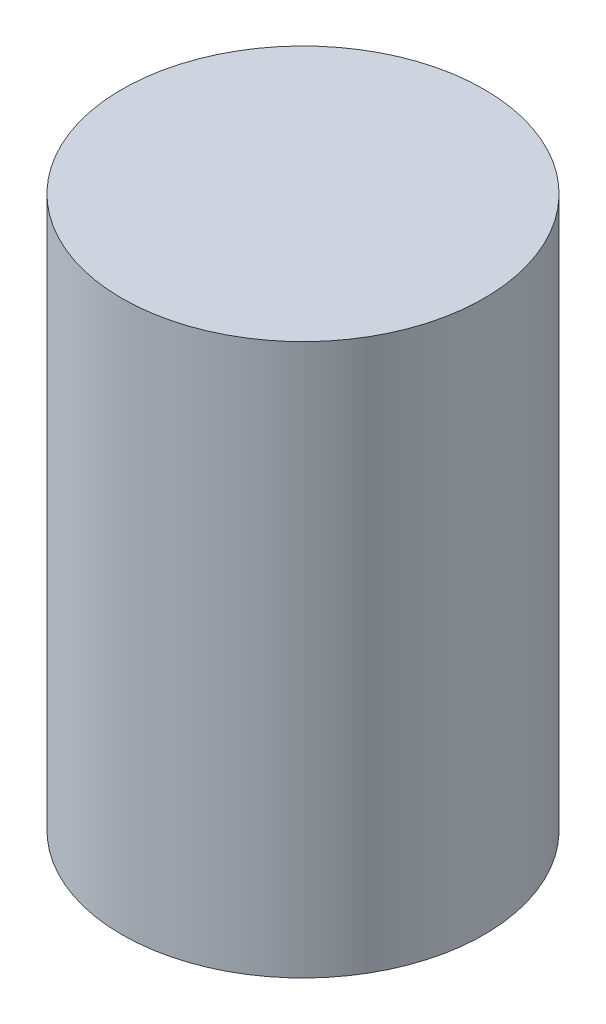
ISO-10303-21;
HEADER;
FILE_DESCRIPTION(('STEP AP214'),'2;1');
FILE_NAME('part.step','',(''),(''),'','','');
FILE_SCHEMA(('AUTOMOTIVE_DESIGN { 1 0 10303 214 1 1 1 1 }'));
ENDSEC;
DATA;
#1=APPLICATION_CONTEXT('core data for automotive mechanical design processes');
#2=APPLICATION_PROTOCOL_DEFINITION('international standard','automotive_design',2000,#1);
#3=PRODUCT_CONTEXT('',#1,'mechanical');
#4=PRODUCT('Part','Part','',(#3));
#5=PRODUCT_RELATED_PRODUCT_CATEGORY('part','',(#4));
#6=PRODUCT_DEFINITION_FORMATION('','',#4);
#7=PRODUCT_DEFINITION_CONTEXT('part definition',#1,'design');
#8=PRODUCT_DEFINITION('design','',#6,#7);
#9=PRODUCT_DEFINITION_SHAPE('','',#8);
#10=(LENGTH_UNIT() NAMED_UNIT(*) SI_UNIT(.MILLI.,.METRE.));
#11=(NAMED_UNIT(*) PLANE_ANGLE_UNIT() SI_UNIT($,.RADIAN.));
#12=(NAMED_UNIT(*) SI_UNIT($,.STERADIAN.) SOLID_ANGLE_UNIT());
#13=UNCERTAINTY_MEASURE_WITH_UNIT(LENGTH_MEASURE(1.E-05),#10,'distance_accuracy_value','');
#14=(GEOMETRIC_REPRESENTATION_CONTEXT(3) GLOBAL_UNCERTAINTY_ASSIGNED_CONTEXT((#13)) GLOBAL_UNIT_ASSIGNED_CONTEXT((#10,
#11,#12)) REPRESENTATION_CONTEXT('',''));
#15=CARTESIAN_POINT('',(0.,0.,0.));
#16=DIRECTION('',(0.,0.,1.));
#17=DIRECTION('',(1.,0.,0.));
#18=AXIS2_PLACEMENT_3D('',#15,#16,#17);
#19=CARTESIAN_POINT('',(0.,889.,0.));
#20=DIRECTION('',(0.,-1.,0.));
#21=DIRECTION('',(0.,0.,-1.));
#22=AXIS2_PLACEMENT_3D('',#19,#20,#21);
#23=CYLINDRICAL_SURFACE('',#22,292.1);
#24=CARTESIAN_POINT('',(0.,889.,0.));
#25=DIRECTION('',(0.,1.,0.));
#26=DIRECTION('',(0.,0.,1.));
#27=AXIS2_PLACEMENT_3D('',#24,#25,#26);
#28=CIRCLE('',#27,292.1);
#29=CARTESIAN_POINT('',(0.,889.,292.1));
#30=VERTEX_POINT('',#29);
#31=EDGE_CURVE('E10',#30,#30,#28,.T.);
#32=ORIENTED_EDGE('',*,*,#31,.F.);
#33=EDGE_LOOP('',(#32));
#34=FACE_BOUND('',#33,.T.);
#35=CARTESIAN_POINT('',(0.,0.,0.));
#36=DIRECTION('',(0.,1.,0.));
#37=DIRECTION('',(0.,0.,1.));
#38=AXIS2_PLACEMENT_3D('',#35,#36,#37);
#39=CIRCLE('',#38,292.1);
#40=CARTESIAN_POINT('',(0.,0.,292.1));
#41=VERTEX_POINT('',#40);
#42=EDGE_CURVE('E38',#41,#41,#39,.T.);
#43=ORIENTED_EDGE('',*,*,#42,.T.);
#44=EDGE_LOOP('',(#43));
#45=FACE_BOUND('',#44,.T.);
#46=ADVANCED_FACE('F35',(#34,#45),#23,.T.);
#47=CARTESIAN_POINT('',(0.,889.,0.));
#48=DIRECTION('',(0.,1.,0.));
#49=DIRECTION('',(0.,0.,1.));
#50=AXIS2_PLACEMENT_3D('',#47,#48,#49);
#51=PLANE('',#50);
#52=ORIENTED_EDGE('',*,*,#31,.T.);
#53=EDGE_LOOP('',(#52));
#54=FACE_BOUND('',#53,.T.);
#55=ADVANCED_FACE('F50',(#54),#51,.T.);
#56=CARTESIAN_POINT('',(0.,0.,0.));
#57=DIRECTION('',(0.,1.,0.));
#58=DIRECTION('',(0.,0.,1.));
#59=AXIS2_PLACEMENT_3D('',#56,#57,#58);
#60=PLANE('',#59);
#61=ORIENTED_EDGE('',*,*,#42,.F.);
#62=EDGE_LOOP('',(#61));
#63=FACE_BOUND('',#62,.T.);
#64=ADVANCED_FACE('F48',(#63),#60,.F.);
#65=CLOSED_SHELL('',(#46,#55,#64));
#66=MANIFOLD_SOLID_BREP('B2',#65);
#67=ADVANCED_BREP_SHAPE_REPRESENTATION('',(#18,#66),#14);
#68=SHAPE_DEFINITION_REPRESENTATION(#9,#67);
ENDSEC;
END-ISO-10303-21;
